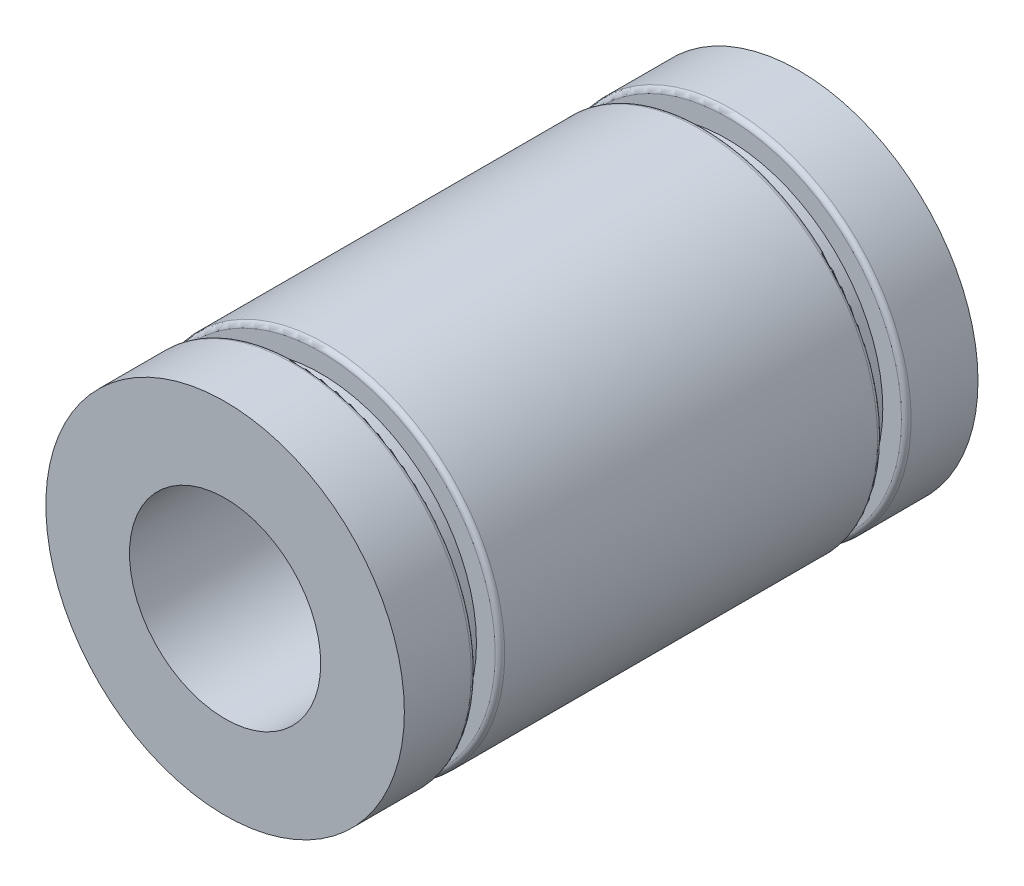
ISO-10303-21;
HEADER;
FILE_DESCRIPTION(('STEP AP214'),'2;1');
FILE_NAME('part.step','',(''),(''),'','','');
FILE_SCHEMA(('AUTOMOTIVE_DESIGN { 1 0 10303 214 1 1 1 1 }'));
ENDSEC;
DATA;
#1=APPLICATION_CONTEXT('core data for automotive mechanical design processes');
#2=APPLICATION_PROTOCOL_DEFINITION('international standard','automotive_design',2000,#1);
#3=PRODUCT_CONTEXT('',#1,'mechanical');
#4=PRODUCT('Part','Part','',(#3));
#5=PRODUCT_RELATED_PRODUCT_CATEGORY('part','',(#4));
#6=PRODUCT_DEFINITION_FORMATION('','',#4);
#7=PRODUCT_DEFINITION_CONTEXT('part definition',#1,'design');
#8=PRODUCT_DEFINITION('design','',#6,#7);
#9=PRODUCT_DEFINITION_SHAPE('','',#8);
#10=(LENGTH_UNIT() NAMED_UNIT(*) SI_UNIT(.MILLI.,.METRE.));
#11=(NAMED_UNIT(*) PLANE_ANGLE_UNIT() SI_UNIT($,.RADIAN.));
#12=(NAMED_UNIT(*) SI_UNIT($,.STERADIAN.) SOLID_ANGLE_UNIT());
#13=UNCERTAINTY_MEASURE_WITH_UNIT(LENGTH_MEASURE(1.E-05),#10,'distance_accuracy_value','');
#14=(GEOMETRIC_REPRESENTATION_CONTEXT(3) GLOBAL_UNCERTAINTY_ASSIGNED_CONTEXT((#13)) GLOBAL_UNIT_ASSIGNED_CONTEXT((#10,
#11,#12)) REPRESENTATION_CONTEXT('',''));
#15=CARTESIAN_POINT('',(0.,0.,0.));
#16=DIRECTION('',(0.,0.,1.));
#17=DIRECTION('',(1.,0.,0.));
#18=AXIS2_PLACEMENT_3D('',#15,#16,#17);
#19=CARTESIAN_POINT('',(0.,0.,24.));
#20=DIRECTION('',(0.,0.,-1.));
#21=DIRECTION('',(-1.,0.,0.));
#22=AXIS2_PLACEMENT_3D('',#19,#20,#21);
#23=CYLINDRICAL_SURFACE('',#22,7.5);
#24=CARTESIAN_POINT('',(0.,0.,21.2));
#25=DIRECTION('',(0.,0.,1.));
#26=DIRECTION('',(1.,0.,0.));
#27=AXIS2_PLACEMENT_3D('',#24,#25,#26);
#28=CIRCLE('',#27,7.5);
#29=CARTESIAN_POINT('',(7.5,0.,21.2));
#30=VERTEX_POINT('',#29);
#31=EDGE_CURVE('E45',#30,#30,#28,.T.);
#32=ORIENTED_EDGE('',*,*,#31,.T.);
#33=EDGE_LOOP('',(#32));
#34=FACE_BOUND('',#33,.T.);
#35=CARTESIAN_POINT('',(0.,0.,24.));
#36=DIRECTION('',(0.,0.,1.));
#37=DIRECTION('',(1.,0.,0.));
#38=AXIS2_PLACEMENT_3D('',#35,#36,#37);
#39=CIRCLE('',#38,7.5);
#40=CARTESIAN_POINT('',(7.5,0.,24.));
#41=VERTEX_POINT('',#40);
#42=EDGE_CURVE('E77',#41,#41,#39,.T.);
#43=ORIENTED_EDGE('',*,*,#42,.F.);
#44=EDGE_LOOP('',(#43));
#45=FACE_BOUND('',#44,.T.);
#46=ADVANCED_FACE('F37',(#34,#45),#23,.T.);
#47=CARTESIAN_POINT('',(0.,0.,24.));
#48=DIRECTION('',(0.,0.,1.));
#49=DIRECTION('',(1.,0.,0.));
#50=AXIS2_PLACEMENT_3D('',#47,#48,#49);
#51=PLANE('',#50);
#52=ORIENTED_EDGE('',*,*,#42,.T.);
#53=EDGE_LOOP('',(#52));
#54=FACE_BOUND('',#53,.T.);
#55=CARTESIAN_POINT('',(0.,0.,24.));
#56=DIRECTION('',(0.,0.,1.));
#57=DIRECTION('',(1.,0.,0.));
#58=AXIS2_PLACEMENT_3D('',#55,#56,#57);
#59=CIRCLE('',#58,4.);
#60=CARTESIAN_POINT('',(4.,0.,24.));
#61=VERTEX_POINT('',#60);
#62=EDGE_CURVE('E82',#61,#61,#59,.T.);
#63=ORIENTED_EDGE('',*,*,#62,.F.);
#64=EDGE_LOOP('',(#63));
#65=FACE_BOUND('',#64,.T.);
#66=ADVANCED_FACE('F135',(#54,#65),#51,.T.);
#67=CARTESIAN_POINT('',(0.,0.,0.));
#68=DIRECTION('',(0.,0.,1.));
#69=DIRECTION('',(1.,0.,0.));
#70=AXIS2_PLACEMENT_3D('',#67,#68,#69);
#71=PLANE('',#70);
#72=CARTESIAN_POINT('',(0.,0.,0.));
#73=DIRECTION('',(0.,0.,1.));
#74=DIRECTION('',(1.,0.,0.));
#75=AXIS2_PLACEMENT_3D('',#72,#73,#74);
#76=CIRCLE('',#75,7.5);
#77=CARTESIAN_POINT('',(7.5,0.,0.));
#78=VERTEX_POINT('',#77);
#79=EDGE_CURVE('E78',#78,#78,#76,.T.);
#80=ORIENTED_EDGE('',*,*,#79,.F.);
#81=EDGE_LOOP('',(#80));
#82=FACE_BOUND('',#81,.T.);
#83=CARTESIAN_POINT('',(0.,0.,0.));
#84=DIRECTION('',(0.,0.,1.));
#85=DIRECTION('',(1.,0.,0.));
#86=AXIS2_PLACEMENT_3D('',#83,#84,#85);
#87=CIRCLE('',#86,4.);
#88=CARTESIAN_POINT('',(4.,0.,0.));
#89=VERTEX_POINT('',#88);
#90=EDGE_CURVE('E86',#89,#89,#87,.T.);
#91=ORIENTED_EDGE('',*,*,#90,.T.);
#92=EDGE_LOOP('',(#91));
#93=FACE_BOUND('',#92,.T.);
#94=ADVANCED_FACE('F139',(#82,#93),#71,.F.);
#95=CARTESIAN_POINT('',(0.,0.,2.8));
#96=DIRECTION('',(0.,0.,-1.));
#97=DIRECTION('',(-1.,0.,0.));
#98=AXIS2_PLACEMENT_3D('',#95,#96,#97);
#99=CIRCLE('',#98,7.5);
#100=CARTESIAN_POINT('',(-7.5,0.,2.8));
#101=VERTEX_POINT('',#100);
#102=EDGE_CURVE('E73',#101,#101,#99,.T.);
#103=ORIENTED_EDGE('',*,*,#102,.T.);
#104=EDGE_LOOP('',(#103));
#105=FACE_BOUND('',#104,.T.);
#106=ORIENTED_EDGE('',*,*,#79,.T.);
#107=EDGE_LOOP('',(#106));
#108=FACE_BOUND('',#107,.T.);
#109=ADVANCED_FACE('F132',(#105,#108),#23,.T.);
#110=CARTESIAN_POINT('',(0.,0.,24.));
#111=DIRECTION('',(0.,0.,-1.));
#112=DIRECTION('',(-1.,0.,0.));
#113=AXIS2_PLACEMENT_3D('',#110,#111,#112);
#114=CYLINDRICAL_SURFACE('',#113,4.);
#115=ORIENTED_EDGE('',*,*,#62,.T.);
#116=EDGE_LOOP('',(#115));
#117=FACE_BOUND('',#116,.T.);
#118=ORIENTED_EDGE('',*,*,#90,.F.);
#119=EDGE_LOOP('',(#118));
#120=FACE_BOUND('',#119,.T.);
#121=ADVANCED_FACE('F146',(#117,#120),#114,.F.);
#122=CARTESIAN_POINT('',(0.,7.5167728438985,4.));
#123=DIRECTION('',(0.,0.,1.));
#124=DIRECTION('',(1.,0.,0.));
#125=AXIS2_PLACEMENT_3D('',#122,#123,#124);
#126=PLANE('',#125);
#127=CARTESIAN_POINT('',(0.,0.,4.));
#128=DIRECTION('',(0.,0.,1.));
#129=DIRECTION('',(1.,0.,0.));
#130=AXIS2_PLACEMENT_3D('',#127,#128,#129);
#131=CIRCLE('',#130,7.3);
#132=CARTESIAN_POINT('',(7.3,0.,4.));
#133=VERTEX_POINT('',#132);
#134=EDGE_CURVE('E55',#133,#133,#131,.F.);
#135=ORIENTED_EDGE('',*,*,#134,.T.);
#136=EDGE_LOOP('',(#135));
#137=FACE_BOUND('',#136,.T.);
#138=CARTESIAN_POINT('',(0.,0.,4.));
#139=DIRECTION('',(0.,0.,-1.));
#140=DIRECTION('',(-1.,0.,0.));
#141=AXIS2_PLACEMENT_3D('',#138,#139,#140);
#142=CIRCLE('',#141,6.5167728438985);
#143=CARTESIAN_POINT('',(-6.5167728438985,0.,4.));
#144=VERTEX_POINT('',#143);
#145=EDGE_CURVE('E94',#144,#144,#142,.T.);
#146=ORIENTED_EDGE('',*,*,#145,.F.);
#147=EDGE_LOOP('',(#146));
#148=FACE_BOUND('',#147,.T.);
#149=ADVANCED_FACE('F152',(#137,#148),#126,.F.);
#150=CARTESIAN_POINT('',(0.,6.5167728438985,3.));
#151=DIRECTION('',(0.,0.,-1.));
#152=DIRECTION('',(-1.,0.,0.));
#153=AXIS2_PLACEMENT_3D('',#150,#151,#152);
#154=PLANE('',#153);
#155=CARTESIAN_POINT('',(0.,0.,3.));
#156=DIRECTION('',(0.,0.,-1.));
#157=DIRECTION('',(-1.,0.,0.));
#158=AXIS2_PLACEMENT_3D('',#155,#156,#157);
#159=CIRCLE('',#158,7.3);
#160=CARTESIAN_POINT('',(-7.3,0.,3.));
#161=VERTEX_POINT('',#160);
#162=EDGE_CURVE('E69',#161,#161,#159,.F.);
#163=ORIENTED_EDGE('',*,*,#162,.T.);
#164=EDGE_LOOP('',(#163));
#165=FACE_BOUND('',#164,.T.);
#166=CARTESIAN_POINT('',(0.,0.,3.));
#167=DIRECTION('',(0.,0.,-1.));
#168=DIRECTION('',(-1.,0.,0.));
#169=AXIS2_PLACEMENT_3D('',#166,#167,#168);
#170=CIRCLE('',#169,6.5167728438985);
#171=CARTESIAN_POINT('',(-6.5167728438985,0.,3.));
#172=VERTEX_POINT('',#171);
#173=EDGE_CURVE('E99',#172,#172,#170,.T.);
#174=ORIENTED_EDGE('',*,*,#173,.T.);
#175=EDGE_LOOP('',(#174));
#176=FACE_BOUND('',#175,.T.);
#177=ADVANCED_FACE('F226',(#165,#176),#154,.F.);
#178=CARTESIAN_POINT('',(0.,0.,0.));
#179=DIRECTION('',(0.,0.,-1.));
#180=DIRECTION('',(-1.,0.,0.));
#181=AXIS2_PLACEMENT_3D('',#178,#179,#180);
#182=CYLINDRICAL_SURFACE('',#181,6.5167728438985);
#183=ORIENTED_EDGE('',*,*,#173,.F.);
#184=EDGE_LOOP('',(#183));
#185=FACE_BOUND('',#184,.T.);
#186=ORIENTED_EDGE('',*,*,#145,.T.);
#187=EDGE_LOOP('',(#186));
#188=FACE_BOUND('',#187,.T.);
#189=ADVANCED_FACE('F129',(#185,#188),#182,.T.);
#190=CARTESIAN_POINT('',(0.,0.,4.2));
#191=DIRECTION('',(0.,0.,1.));
#192=DIRECTION('',(1.,0.,0.));
#193=AXIS2_PLACEMENT_3D('',#190,#191,#192);
#194=CIRCLE('',#193,7.5);
#195=CARTESIAN_POINT('',(7.5,0.,4.2));
#196=VERTEX_POINT('',#195);
#197=EDGE_CURVE('E61',#196,#196,#194,.T.);
#198=ORIENTED_EDGE('',*,*,#197,.T.);
#199=EDGE_LOOP('',(#198));
#200=FACE_BOUND('',#199,.T.);
#201=CARTESIAN_POINT('',(0.,0.,19.8));
#202=DIRECTION('',(0.,0.,-1.));
#203=DIRECTION('',(-1.,0.,0.));
#204=AXIS2_PLACEMENT_3D('',#201,#202,#203);
#205=CIRCLE('',#204,7.5);
#206=CARTESIAN_POINT('',(-7.5,0.,19.8));
#207=VERTEX_POINT('',#206);
#208=EDGE_CURVE('E65',#207,#207,#205,.T.);
#209=ORIENTED_EDGE('',*,*,#208,.T.);
#210=EDGE_LOOP('',(#209));
#211=FACE_BOUND('',#210,.T.);
#212=ADVANCED_FACE('F121',(#200,#211),#23,.T.);
#213=CARTESIAN_POINT('',(0.,7.5167728438985,21.));
#214=DIRECTION('',(0.,0.,1.));
#215=DIRECTION('',(1.,0.,0.));
#216=AXIS2_PLACEMENT_3D('',#213,#214,#215);
#217=PLANE('',#216);
#218=CARTESIAN_POINT('',(0.,0.,21.));
#219=DIRECTION('',(0.,0.,1.));
#220=DIRECTION('',(1.,0.,0.));
#221=AXIS2_PLACEMENT_3D('',#218,#219,#220);
#222=CIRCLE('',#221,7.3);
#223=CARTESIAN_POINT('',(7.3,0.,21.));
#224=VERTEX_POINT('',#223);
#225=EDGE_CURVE('E10',#224,#224,#222,.F.);
#226=ORIENTED_EDGE('',*,*,#225,.T.);
#227=EDGE_LOOP('',(#226));
#228=FACE_BOUND('',#227,.T.);
#229=CARTESIAN_POINT('',(0.,0.,21.));
#230=DIRECTION('',(0.,0.,-1.));
#231=DIRECTION('',(-1.,0.,0.));
#232=AXIS2_PLACEMENT_3D('',#229,#230,#231);
#233=CIRCLE('',#232,6.5167728438985);
#234=CARTESIAN_POINT('',(-6.5167728438985,0.,21.));
#235=VERTEX_POINT('',#234);
#236=EDGE_CURVE('E90',#235,#235,#233,.T.);
#237=ORIENTED_EDGE('',*,*,#236,.F.);
#238=EDGE_LOOP('',(#237));
#239=FACE_BOUND('',#238,.T.);
#240=ADVANCED_FACE('F119',(#228,#239),#217,.F.);
#241=CARTESIAN_POINT('',(0.,6.5167728438985,20.));
#242=DIRECTION('',(0.,0.,-1.));
#243=DIRECTION('',(-1.,0.,0.));
#244=AXIS2_PLACEMENT_3D('',#241,#242,#243);
#245=PLANE('',#244);
#246=CARTESIAN_POINT('',(0.,0.,20.));
#247=DIRECTION('',(0.,0.,-1.));
#248=DIRECTION('',(-1.,0.,0.));
#249=AXIS2_PLACEMENT_3D('',#246,#247,#248);
#250=CIRCLE('',#249,7.3);
#251=CARTESIAN_POINT('',(-7.3,0.,20.));
#252=VERTEX_POINT('',#251);
#253=EDGE_CURVE('E50',#252,#252,#250,.F.);
#254=ORIENTED_EDGE('',*,*,#253,.T.);
#255=EDGE_LOOP('',(#254));
#256=FACE_BOUND('',#255,.T.);
#257=CARTESIAN_POINT('',(0.,0.,20.));
#258=DIRECTION('',(0.,0.,-1.));
#259=DIRECTION('',(-1.,0.,0.));
#260=AXIS2_PLACEMENT_3D('',#257,#258,#259);
#261=CIRCLE('',#260,6.5167728438985);
#262=CARTESIAN_POINT('',(-6.5167728438985,0.,20.));
#263=VERTEX_POINT('',#262);
#264=EDGE_CURVE('E98',#263,#263,#261,.T.);
#265=ORIENTED_EDGE('',*,*,#264,.T.);
#266=EDGE_LOOP('',(#265));
#267=FACE_BOUND('',#266,.T.);
#268=ADVANCED_FACE('F110',(#256,#267),#245,.F.);
#269=CARTESIAN_POINT('',(0.,0.,0.));
#270=DIRECTION('',(0.,0.,-1.));
#271=DIRECTION('',(-1.,0.,0.));
#272=AXIS2_PLACEMENT_3D('',#269,#270,#271);
#273=CYLINDRICAL_SURFACE('',#272,6.5167728438985);
#274=ORIENTED_EDGE('',*,*,#264,.F.);
#275=EDGE_LOOP('',(#274));
#276=FACE_BOUND('',#275,.T.);
#277=ORIENTED_EDGE('',*,*,#236,.T.);
#278=EDGE_LOOP('',(#277));
#279=FACE_BOUND('',#278,.T.);
#280=ADVANCED_FACE('F112',(#276,#279),#273,.T.);
#281=CARTESIAN_POINT('',(0.,0.,2.8));
#282=DIRECTION('',(0.,0.,-1.));
#283=DIRECTION('',(-1.,0.,0.));
#284=AXIS2_PLACEMENT_3D('',#281,#282,#283);
#285=TOROIDAL_SURFACE('',#284,7.3,0.2);
#286=ORIENTED_EDGE('',*,*,#162,.F.);
#287=EDGE_LOOP('',(#286));
#288=FACE_BOUND('',#287,.T.);
#289=ORIENTED_EDGE('',*,*,#102,.F.);
#290=EDGE_LOOP('',(#289));
#291=FACE_BOUND('',#290,.T.);
#292=ADVANCED_FACE('F115',(#288,#291),#285,.T.);
#293=CARTESIAN_POINT('',(0.,0.,4.2));
#294=DIRECTION('',(0.,0.,1.));
#295=DIRECTION('',(1.,0.,0.));
#296=AXIS2_PLACEMENT_3D('',#293,#294,#295);
#297=TOROIDAL_SURFACE('',#296,7.3,0.2);
#298=ORIENTED_EDGE('',*,*,#134,.F.);
#299=EDGE_LOOP('',(#298));
#300=FACE_BOUND('',#299,.T.);
#301=ORIENTED_EDGE('',*,*,#197,.F.);
#302=EDGE_LOOP('',(#301));
#303=FACE_BOUND('',#302,.T.);
#304=ADVANCED_FACE('F164',(#300,#303),#297,.T.);
#305=CARTESIAN_POINT('',(0.,0.,19.8));
#306=DIRECTION('',(0.,0.,-1.));
#307=DIRECTION('',(-1.,0.,0.));
#308=AXIS2_PLACEMENT_3D('',#305,#306,#307);
#309=TOROIDAL_SURFACE('',#308,7.3,0.2);
#310=ORIENTED_EDGE('',*,*,#253,.F.);
#311=EDGE_LOOP('',(#310));
#312=FACE_BOUND('',#311,.T.);
#313=ORIENTED_EDGE('',*,*,#208,.F.);
#314=EDGE_LOOP('',(#313));
#315=FACE_BOUND('',#314,.T.);
#316=ADVANCED_FACE('F169',(#312,#315),#309,.T.);
#317=CARTESIAN_POINT('',(0.,0.,21.2));
#318=DIRECTION('',(0.,0.,1.));
#319=DIRECTION('',(1.,0.,0.));
#320=AXIS2_PLACEMENT_3D('',#317,#318,#319);
#321=TOROIDAL_SURFACE('',#320,7.3,0.2);
#322=ORIENTED_EDGE('',*,*,#225,.F.);
#323=EDGE_LOOP('',(#322));
#324=FACE_BOUND('',#323,.T.);
#325=ORIENTED_EDGE('',*,*,#31,.F.);
#326=EDGE_LOOP('',(#325));
#327=FACE_BOUND('',#326,.T.);
#328=ADVANCED_FACE('F39',(#324,#327),#321,.T.);
#329=CLOSED_SHELL('',(#46,#66,#94,#109,#121,#149,#177,#189,#212,#240,#268,#280,#292,#304,#316,#328));
#330=MANIFOLD_SOLID_BREP('B2',#329);
#331=ADVANCED_BREP_SHAPE_REPRESENTATION('',(#18,#330),#14);
#332=SHAPE_DEFINITION_REPRESENTATION(#9,#331);
ENDSEC;
END-ISO-10303-21;
